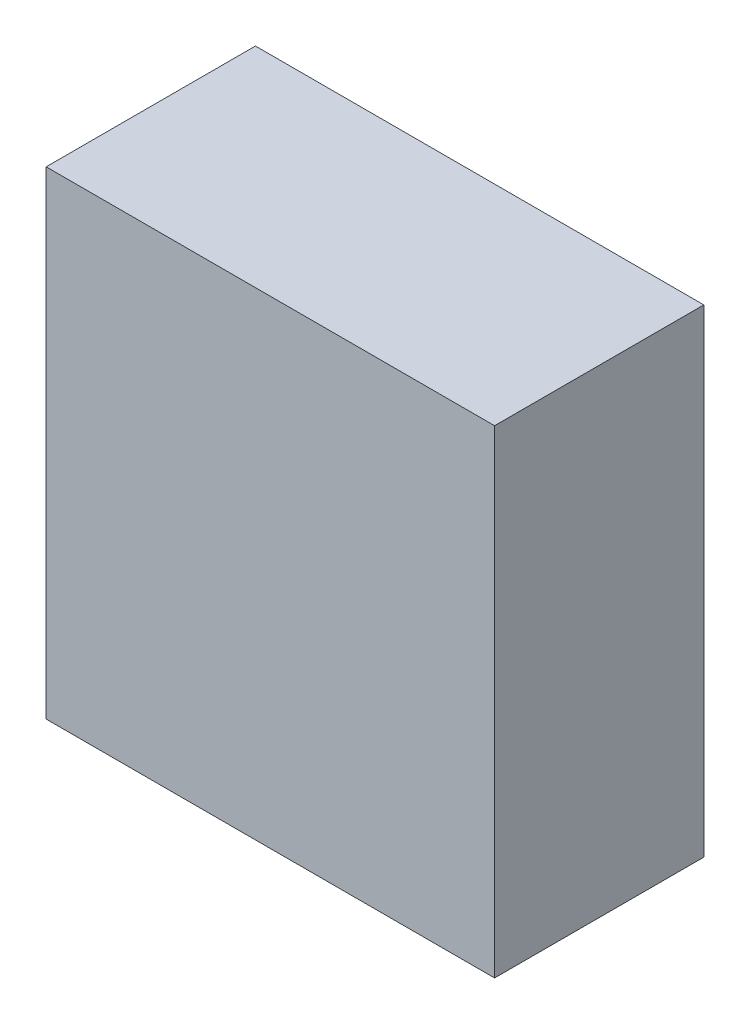
ISO-10303-21;
HEADER;
FILE_DESCRIPTION(('STEP AP214'),'2;1');
FILE_NAME('part.step','',(''),(''),'','','');
FILE_SCHEMA(('AUTOMOTIVE_DESIGN { 1 0 10303 214 1 1 1 1 }'));
ENDSEC;
DATA;
#1=APPLICATION_CONTEXT('core data for automotive mechanical design processes');
#2=APPLICATION_PROTOCOL_DEFINITION('international standard','automotive_design',2000,#1);
#3=PRODUCT_CONTEXT('',#1,'mechanical');
#4=PRODUCT('Part','Part','',(#3));
#5=PRODUCT_RELATED_PRODUCT_CATEGORY('part','',(#4));
#6=PRODUCT_DEFINITION_FORMATION('','',#4);
#7=PRODUCT_DEFINITION_CONTEXT('part definition',#1,'design');
#8=PRODUCT_DEFINITION('design','',#6,#7);
#9=PRODUCT_DEFINITION_SHAPE('','',#8);
#10=(LENGTH_UNIT() NAMED_UNIT(*) SI_UNIT(.MILLI.,.METRE.));
#11=(NAMED_UNIT(*) PLANE_ANGLE_UNIT() SI_UNIT($,.RADIAN.));
#12=(NAMED_UNIT(*) SI_UNIT($,.STERADIAN.) SOLID_ANGLE_UNIT());
#13=UNCERTAINTY_MEASURE_WITH_UNIT(LENGTH_MEASURE(1.E-05),#10,'distance_accuracy_value','');
#14=(GEOMETRIC_REPRESENTATION_CONTEXT(3) GLOBAL_UNCERTAINTY_ASSIGNED_CONTEXT((#13)) GLOBAL_UNIT_ASSIGNED_CONTEXT((#10,
#11,#12)) REPRESENTATION_CONTEXT('',''));
#15=CARTESIAN_POINT('',(0.,0.,0.));
#16=DIRECTION('',(0.,0.,1.));
#17=DIRECTION('',(1.,0.,0.));
#18=AXIS2_PLACEMENT_3D('',#15,#16,#17);
#19=CARTESIAN_POINT('',(0.,0.,14.));
#20=DIRECTION('',(-1.,0.,0.));
#21=DIRECTION('',(0.,0.,1.));
#22=AXIS2_PLACEMENT_3D('',#19,#20,#21);
#23=PLANE('',#22);
#24=DIRECTION('',(0.,1.,0.));
#25=VECTOR('',#24,1.);
#26=CARTESIAN_POINT('',(0.,0.,0.));
#27=LINE('',#26,#25);
#28=CARTESIAN_POINT('',(0.,0.,0.));
#29=VERTEX_POINT('',#28);
#30=CARTESIAN_POINT('',(0.,32.,0.));
#31=VERTEX_POINT('',#30);
#32=EDGE_CURVE('E95',#29,#31,#27,.T.);
#33=ORIENTED_EDGE('',*,*,#32,.T.);
#34=DIRECTION('',(0.,0.,-1.));
#35=VECTOR('',#34,1.);
#36=CARTESIAN_POINT('',(0.,32.,14.));
#37=LINE('',#36,#35);
#38=CARTESIAN_POINT('',(0.,32.,14.));
#39=VERTEX_POINT('',#38);
#40=EDGE_CURVE('E11',#39,#31,#37,.T.);
#41=ORIENTED_EDGE('',*,*,#40,.F.);
#42=DIRECTION('',(0.,1.,0.));
#43=VECTOR('',#42,1.);
#44=CARTESIAN_POINT('',(0.,0.,14.));
#45=LINE('',#44,#43);
#46=CARTESIAN_POINT('',(0.,0.,14.));
#47=VERTEX_POINT('',#46);
#48=EDGE_CURVE('E83',#47,#39,#45,.T.);
#49=ORIENTED_EDGE('',*,*,#48,.F.);
#50=DIRECTION('',(0.,0.,-1.));
#51=VECTOR('',#50,1.);
#52=CARTESIAN_POINT('',(0.,0.,14.));
#53=LINE('',#52,#51);
#54=EDGE_CURVE('E91',#47,#29,#53,.T.);
#55=ORIENTED_EDGE('',*,*,#54,.T.);
#56=EDGE_LOOP('',(#33,#41,#49,#55));
#57=FACE_BOUND('',#56,.T.);
#58=ADVANCED_FACE('F32',(#57),#23,.F.);
#59=CARTESIAN_POINT('',(0.,32.,14.));
#60=DIRECTION('',(0.,-1.,0.));
#61=DIRECTION('',(1.,0.,0.));
#62=AXIS2_PLACEMENT_3D('',#59,#60,#61);
#63=PLANE('',#62);
#64=DIRECTION('',(-1.,0.,0.));
#65=VECTOR('',#64,1.);
#66=CARTESIAN_POINT('',(0.,32.,0.));
#67=LINE('',#66,#65);
#68=CARTESIAN_POINT('',(-30.,32.,0.));
#69=VERTEX_POINT('',#68);
#70=EDGE_CURVE('E87',#31,#69,#67,.T.);
#71=ORIENTED_EDGE('',*,*,#70,.T.);
#72=DIRECTION('',(0.,0.,-1.));
#73=VECTOR('',#72,1.);
#74=CARTESIAN_POINT('',(-30.,32.,14.));
#75=LINE('',#74,#73);
#76=CARTESIAN_POINT('',(-30.,32.,14.));
#77=VERTEX_POINT('',#76);
#78=EDGE_CURVE('E40',#77,#69,#75,.T.);
#79=ORIENTED_EDGE('',*,*,#78,.F.);
#80=DIRECTION('',(-1.,0.,0.));
#81=VECTOR('',#80,1.);
#82=CARTESIAN_POINT('',(0.,32.,14.));
#83=LINE('',#82,#81);
#84=EDGE_CURVE('E78',#39,#77,#83,.T.);
#85=ORIENTED_EDGE('',*,*,#84,.F.);
#86=ORIENTED_EDGE('',*,*,#40,.T.);
#87=EDGE_LOOP('',(#71,#79,#85,#86));
#88=FACE_BOUND('',#87,.T.);
#89=ADVANCED_FACE('F86',(#88),#63,.F.);
#90=CARTESIAN_POINT('',(-30.,0.,14.));
#91=DIRECTION('',(1.,0.,0.));
#92=DIRECTION('',(0.,0.,-1.));
#93=AXIS2_PLACEMENT_3D('',#90,#91,#92);
#94=PLANE('',#93);
#95=DIRECTION('',(0.,-1.,0.));
#96=VECTOR('',#95,1.);
#97=CARTESIAN_POINT('',(-30.,0.,0.));
#98=LINE('',#97,#96);
#99=CARTESIAN_POINT('',(-30.,0.,0.));
#100=VERTEX_POINT('',#99);
#101=EDGE_CURVE('E65',#69,#100,#98,.T.);
#102=ORIENTED_EDGE('',*,*,#101,.T.);
#103=DIRECTION('',(0.,0.,-1.));
#104=VECTOR('',#103,1.);
#105=CARTESIAN_POINT('',(-30.,0.,14.));
#106=LINE('',#105,#104);
#107=CARTESIAN_POINT('',(-30.,0.,14.));
#108=VERTEX_POINT('',#107);
#109=EDGE_CURVE('E88',#108,#100,#106,.T.);
#110=ORIENTED_EDGE('',*,*,#109,.F.);
#111=DIRECTION('',(0.,-1.,0.));
#112=VECTOR('',#111,1.);
#113=CARTESIAN_POINT('',(-30.,0.,14.));
#114=LINE('',#113,#112);
#115=EDGE_CURVE('E81',#77,#108,#114,.T.);
#116=ORIENTED_EDGE('',*,*,#115,.F.);
#117=ORIENTED_EDGE('',*,*,#78,.T.);
#118=EDGE_LOOP('',(#102,#110,#116,#117));
#119=FACE_BOUND('',#118,.T.);
#120=ADVANCED_FACE('F89',(#119),#94,.F.);
#121=CARTESIAN_POINT('',(0.,0.,14.));
#122=DIRECTION('',(0.,1.,0.));
#123=DIRECTION('',(-1.,0.,0.));
#124=AXIS2_PLACEMENT_3D('',#121,#122,#123);
#125=PLANE('',#124);
#126=DIRECTION('',(1.,0.,0.));
#127=VECTOR('',#126,1.);
#128=CARTESIAN_POINT('',(0.,0.,0.));
#129=LINE('',#128,#127);
#130=EDGE_CURVE('E71',#100,#29,#129,.T.);
#131=ORIENTED_EDGE('',*,*,#130,.T.);
#132=ORIENTED_EDGE('',*,*,#54,.F.);
#133=DIRECTION('',(1.,0.,0.));
#134=VECTOR('',#133,1.);
#135=CARTESIAN_POINT('',(0.,0.,14.));
#136=LINE('',#135,#134);
#137=EDGE_CURVE('E48',#108,#47,#136,.T.);
#138=ORIENTED_EDGE('',*,*,#137,.F.);
#139=ORIENTED_EDGE('',*,*,#109,.T.);
#140=EDGE_LOOP('',(#131,#132,#138,#139));
#141=FACE_BOUND('',#140,.T.);
#142=ADVANCED_FACE('F102',(#141),#125,.F.);
#143=CARTESIAN_POINT('',(0.,0.,14.));
#144=DIRECTION('',(0.,0.,1.));
#145=DIRECTION('',(1.,0.,0.));
#146=AXIS2_PLACEMENT_3D('',#143,#144,#145);
#147=PLANE('',#146);
#148=ORIENTED_EDGE('',*,*,#48,.T.);
#149=ORIENTED_EDGE('',*,*,#84,.T.);
#150=ORIENTED_EDGE('',*,*,#115,.T.);
#151=ORIENTED_EDGE('',*,*,#137,.T.);
#152=EDGE_LOOP('',(#148,#149,#150,#151));
#153=FACE_BOUND('',#152,.T.);
#154=ADVANCED_FACE('F79',(#153),#147,.T.);
#155=CARTESIAN_POINT('',(0.,0.,0.));
#156=DIRECTION('',(0.,0.,1.));
#157=DIRECTION('',(1.,0.,0.));
#158=AXIS2_PLACEMENT_3D('',#155,#156,#157);
#159=PLANE('',#158);
#160=ORIENTED_EDGE('',*,*,#32,.F.);
#161=ORIENTED_EDGE('',*,*,#130,.F.);
#162=ORIENTED_EDGE('',*,*,#101,.F.);
#163=ORIENTED_EDGE('',*,*,#70,.F.);
#164=EDGE_LOOP('',(#160,#161,#162,#163));
#165=FACE_BOUND('',#164,.T.);
#166=ADVANCED_FACE('F105',(#165),#159,.F.);
#167=CLOSED_SHELL('',(#58,#89,#120,#142,#154,#166));
#168=MANIFOLD_SOLID_BREP('B2',#167);
#169=ADVANCED_BREP_SHAPE_REPRESENTATION('',(#18,#168),#14);
#170=SHAPE_DEFINITION_REPRESENTATION(#9,#169);
ENDSEC;
END-ISO-10303-21;
